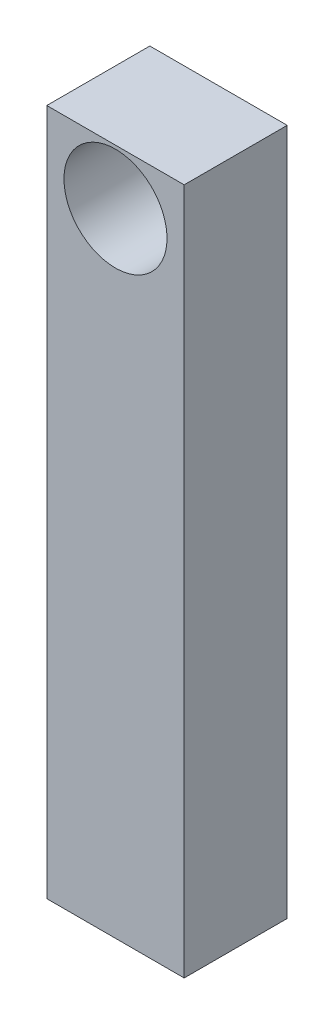
ISO-10303-21;
HEADER;
FILE_DESCRIPTION(('STEP AP214'),'2;1');
FILE_NAME('part.step','',(''),(''),'','','');
FILE_SCHEMA(('AUTOMOTIVE_DESIGN { 1 0 10303 214 1 1 1 1 }'));
ENDSEC;
DATA;
#1=APPLICATION_CONTEXT('core data for automotive mechanical design processes');
#2=APPLICATION_PROTOCOL_DEFINITION('international standard','automotive_design',2000,#1);
#3=PRODUCT_CONTEXT('',#1,'mechanical');
#4=PRODUCT('Part','Part','',(#3));
#5=PRODUCT_RELATED_PRODUCT_CATEGORY('part','',(#4));
#6=PRODUCT_DEFINITION_FORMATION('','',#4);
#7=PRODUCT_DEFINITION_CONTEXT('part definition',#1,'design');
#8=PRODUCT_DEFINITION('design','',#6,#7);
#9=PRODUCT_DEFINITION_SHAPE('','',#8);
#10=(LENGTH_UNIT() NAMED_UNIT(*) SI_UNIT(.MILLI.,.METRE.));
#11=(NAMED_UNIT(*) PLANE_ANGLE_UNIT() SI_UNIT($,.RADIAN.));
#12=(NAMED_UNIT(*) SI_UNIT($,.STERADIAN.) SOLID_ANGLE_UNIT());
#13=UNCERTAINTY_MEASURE_WITH_UNIT(LENGTH_MEASURE(1.E-05),#10,'distance_accuracy_value','');
#14=(GEOMETRIC_REPRESENTATION_CONTEXT(3) GLOBAL_UNCERTAINTY_ASSIGNED_CONTEXT((#13)) GLOBAL_UNIT_ASSIGNED_CONTEXT((#10,
#11,#12)) REPRESENTATION_CONTEXT('',''));
#15=CARTESIAN_POINT('',(0.,0.,0.));
#16=DIRECTION('',(0.,0.,1.));
#17=DIRECTION('',(1.,0.,0.));
#18=AXIS2_PLACEMENT_3D('',#15,#16,#17);
#19=CARTESIAN_POINT('',(2.,10.,3.));
#20=DIRECTION('',(-1.,0.,0.));
#21=DIRECTION('',(0.,-1.,0.));
#22=AXIS2_PLACEMENT_3D('',#19,#20,#21);
#23=PLANE('',#22);
#24=DIRECTION('',(0.,1.,0.));
#25=VECTOR('',#24,1.);
#26=CARTESIAN_POINT('',(2.,10.,0.));
#27=LINE('',#26,#25);
#28=CARTESIAN_POINT('',(2.,-10.,0.));
#29=VERTEX_POINT('',#28);
#30=CARTESIAN_POINT('',(2.,10.,0.));
#31=VERTEX_POINT('',#30);
#32=EDGE_CURVE('E96',#29,#31,#27,.T.);
#33=ORIENTED_EDGE('',*,*,#32,.T.);
#34=DIRECTION('',(0.,0.,-1.));
#35=VECTOR('',#34,1.);
#36=CARTESIAN_POINT('',(2.,10.,3.));
#37=LINE('',#36,#35);
#38=CARTESIAN_POINT('',(2.,10.,3.));
#39=VERTEX_POINT('',#38);
#40=EDGE_CURVE('E11',#39,#31,#37,.T.);
#41=ORIENTED_EDGE('',*,*,#40,.F.);
#42=DIRECTION('',(0.,1.,0.));
#43=VECTOR('',#42,1.);
#44=CARTESIAN_POINT('',(2.,10.,3.));
#45=LINE('',#44,#43);
#46=CARTESIAN_POINT('',(2.,-10.,3.));
#47=VERTEX_POINT('',#46);
#48=EDGE_CURVE('E84',#47,#39,#45,.T.);
#49=ORIENTED_EDGE('',*,*,#48,.F.);
#50=DIRECTION('',(0.,0.,-1.));
#51=VECTOR('',#50,1.);
#52=CARTESIAN_POINT('',(2.,-10.,3.));
#53=LINE('',#52,#51);
#54=EDGE_CURVE('E92',#47,#29,#53,.T.);
#55=ORIENTED_EDGE('',*,*,#54,.T.);
#56=EDGE_LOOP('',(#33,#41,#49,#55));
#57=FACE_BOUND('',#56,.T.);
#58=ADVANCED_FACE('F33',(#57),#23,.F.);
#59=CARTESIAN_POINT('',(-2.,10.,3.));
#60=DIRECTION('',(0.,-1.,0.));
#61=DIRECTION('',(0.,0.,-1.));
#62=AXIS2_PLACEMENT_3D('',#59,#60,#61);
#63=PLANE('',#62);
#64=DIRECTION('',(-1.,0.,0.));
#65=VECTOR('',#64,1.);
#66=CARTESIAN_POINT('',(-2.,10.,0.));
#67=LINE('',#66,#65);
#68=CARTESIAN_POINT('',(-2.,10.,0.));
#69=VERTEX_POINT('',#68);
#70=EDGE_CURVE('E88',#31,#69,#67,.T.);
#71=ORIENTED_EDGE('',*,*,#70,.T.);
#72=DIRECTION('',(0.,0.,-1.));
#73=VECTOR('',#72,1.);
#74=CARTESIAN_POINT('',(-2.,10.,3.));
#75=LINE('',#74,#73);
#76=CARTESIAN_POINT('',(-2.,10.,3.));
#77=VERTEX_POINT('',#76);
#78=EDGE_CURVE('E41',#77,#69,#75,.T.);
#79=ORIENTED_EDGE('',*,*,#78,.F.);
#80=DIRECTION('',(-1.,0.,0.));
#81=VECTOR('',#80,1.);
#82=CARTESIAN_POINT('',(-2.,10.,3.));
#83=LINE('',#82,#81);
#84=EDGE_CURVE('E79',#39,#77,#83,.T.);
#85=ORIENTED_EDGE('',*,*,#84,.F.);
#86=ORIENTED_EDGE('',*,*,#40,.T.);
#87=EDGE_LOOP('',(#71,#79,#85,#86));
#88=FACE_BOUND('',#87,.T.);
#89=ADVANCED_FACE('F87',(#88),#63,.F.);
#90=CARTESIAN_POINT('',(-2.,10.,3.));
#91=DIRECTION('',(1.,0.,0.));
#92=DIRECTION('',(0.,1.,0.));
#93=AXIS2_PLACEMENT_3D('',#90,#91,#92);
#94=PLANE('',#93);
#95=DIRECTION('',(0.,-1.,0.));
#96=VECTOR('',#95,1.);
#97=CARTESIAN_POINT('',(-2.,10.,0.));
#98=LINE('',#97,#96);
#99=CARTESIAN_POINT('',(-2.,-10.,0.));
#100=VERTEX_POINT('',#99);
#101=EDGE_CURVE('E66',#69,#100,#98,.T.);
#102=ORIENTED_EDGE('',*,*,#101,.T.);
#103=DIRECTION('',(0.,0.,-1.));
#104=VECTOR('',#103,1.);
#105=CARTESIAN_POINT('',(-2.,-10.,3.));
#106=LINE('',#105,#104);
#107=CARTESIAN_POINT('',(-2.,-10.,3.));
#108=VERTEX_POINT('',#107);
#109=EDGE_CURVE('E89',#108,#100,#106,.T.);
#110=ORIENTED_EDGE('',*,*,#109,.F.);
#111=DIRECTION('',(0.,-1.,0.));
#112=VECTOR('',#111,1.);
#113=CARTESIAN_POINT('',(-2.,10.,3.));
#114=LINE('',#113,#112);
#115=EDGE_CURVE('E82',#77,#108,#114,.T.);
#116=ORIENTED_EDGE('',*,*,#115,.F.);
#117=ORIENTED_EDGE('',*,*,#78,.T.);
#118=EDGE_LOOP('',(#102,#110,#116,#117));
#119=FACE_BOUND('',#118,.T.);
#120=ADVANCED_FACE('F90',(#119),#94,.F.);
#121=CARTESIAN_POINT('',(-2.,-10.,3.));
#122=DIRECTION('',(0.,1.,0.));
#123=DIRECTION('',(0.,0.,1.));
#124=AXIS2_PLACEMENT_3D('',#121,#122,#123);
#125=PLANE('',#124);
#126=DIRECTION('',(1.,0.,0.));
#127=VECTOR('',#126,1.);
#128=CARTESIAN_POINT('',(-2.,-10.,0.));
#129=LINE('',#128,#127);
#130=EDGE_CURVE('E72',#100,#29,#129,.T.);
#131=ORIENTED_EDGE('',*,*,#130,.T.);
#132=ORIENTED_EDGE('',*,*,#54,.F.);
#133=DIRECTION('',(1.,0.,0.));
#134=VECTOR('',#133,1.);
#135=CARTESIAN_POINT('',(-2.,-10.,3.));
#136=LINE('',#135,#134);
#137=EDGE_CURVE('E49',#108,#47,#136,.T.);
#138=ORIENTED_EDGE('',*,*,#137,.F.);
#139=ORIENTED_EDGE('',*,*,#109,.T.);
#140=EDGE_LOOP('',(#131,#132,#138,#139));
#141=FACE_BOUND('',#140,.T.);
#142=ADVANCED_FACE('F104',(#141),#125,.F.);
#143=CARTESIAN_POINT('',(0.,0.,3.));
#144=DIRECTION('',(0.,0.,1.));
#145=DIRECTION('',(1.,0.,0.));
#146=AXIS2_PLACEMENT_3D('',#143,#144,#145);
#147=PLANE('',#146);
#148=CARTESIAN_POINT('',(0.,8.4,3.));
#149=DIRECTION('',(0.,0.,-1.));
#150=DIRECTION('',(-1.,0.,0.));
#151=AXIS2_PLACEMENT_3D('',#148,#149,#150);
#152=CIRCLE('',#151,1.5);
#153=CARTESIAN_POINT('',(-1.5,8.4,3.));
#154=VERTEX_POINT('',#153);
#155=EDGE_CURVE('E99',#154,#154,#152,.T.);
#156=ORIENTED_EDGE('',*,*,#155,.T.);
#157=EDGE_LOOP('',(#156));
#158=FACE_BOUND('',#157,.T.);
#159=ORIENTED_EDGE('',*,*,#48,.T.);
#160=ORIENTED_EDGE('',*,*,#84,.T.);
#161=ORIENTED_EDGE('',*,*,#115,.T.);
#162=ORIENTED_EDGE('',*,*,#137,.T.);
#163=EDGE_LOOP('',(#159,#160,#161,#162));
#164=FACE_BOUND('',#163,.T.);
#165=ADVANCED_FACE('F80',(#158,#164),#147,.T.);
#166=CARTESIAN_POINT('',(0.,0.,0.));
#167=DIRECTION('',(0.,0.,1.));
#168=DIRECTION('',(1.,0.,0.));
#169=AXIS2_PLACEMENT_3D('',#166,#167,#168);
#170=PLANE('',#169);
#171=CARTESIAN_POINT('',(0.,8.4,0.));
#172=DIRECTION('',(0.,0.,-1.));
#173=DIRECTION('',(-1.,0.,0.));
#174=AXIS2_PLACEMENT_3D('',#171,#172,#173);
#175=CIRCLE('',#174,1.5);
#176=CARTESIAN_POINT('',(-1.5,8.4,0.));
#177=VERTEX_POINT('',#176);
#178=EDGE_CURVE('E110',#177,#177,#175,.T.);
#179=ORIENTED_EDGE('',*,*,#178,.F.);
#180=EDGE_LOOP('',(#179));
#181=FACE_BOUND('',#180,.T.);
#182=ORIENTED_EDGE('',*,*,#32,.F.);
#183=ORIENTED_EDGE('',*,*,#130,.F.);
#184=ORIENTED_EDGE('',*,*,#101,.F.);
#185=ORIENTED_EDGE('',*,*,#70,.F.);
#186=EDGE_LOOP('',(#182,#183,#184,#185));
#187=FACE_BOUND('',#186,.T.);
#188=ADVANCED_FACE('F107',(#181,#187),#170,.F.);
#189=CARTESIAN_POINT('',(0.,8.4,3.));
#190=DIRECTION('',(0.,0.,-1.));
#191=DIRECTION('',(-1.,0.,0.));
#192=AXIS2_PLACEMENT_3D('',#189,#190,#191);
#193=CYLINDRICAL_SURFACE('',#192,1.5);
#194=ORIENTED_EDGE('',*,*,#155,.F.);
#195=EDGE_LOOP('',(#194));
#196=FACE_BOUND('',#195,.T.);
#197=ORIENTED_EDGE('',*,*,#178,.T.);
#198=EDGE_LOOP('',(#197));
#199=FACE_BOUND('',#198,.T.);
#200=ADVANCED_FACE('F117',(#196,#199),#193,.F.);
#201=CLOSED_SHELL('',(#58,#89,#120,#142,#165,#188,#200));
#202=MANIFOLD_SOLID_BREP('B2',#201);
#203=ADVANCED_BREP_SHAPE_REPRESENTATION('',(#18,#202),#14);
#204=SHAPE_DEFINITION_REPRESENTATION(#9,#203);
ENDSEC;
END-ISO-10303-21;
